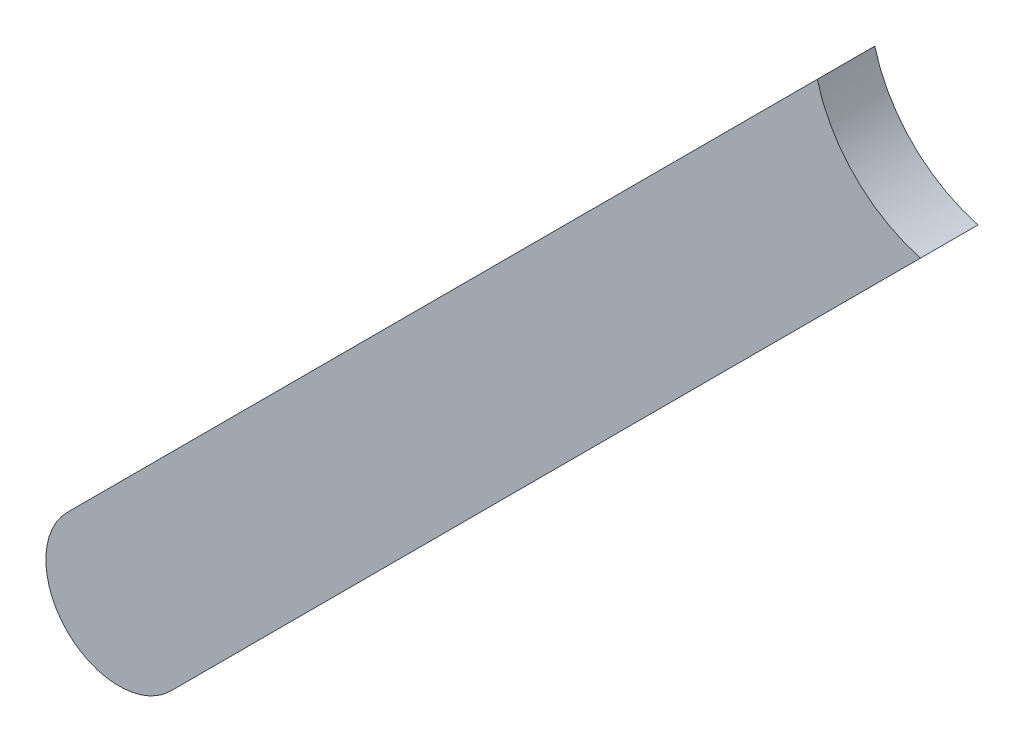
ISO-10303-21;
HEADER;
FILE_DESCRIPTION(('STEP AP214'),'2;1');
FILE_NAME('part.step','',(''),(''),'','','');
FILE_SCHEMA(('AUTOMOTIVE_DESIGN { 1 0 10303 214 1 1 1 1 }'));
ENDSEC;
DATA;
#1=APPLICATION_CONTEXT('core data for automotive mechanical design processes');
#2=APPLICATION_PROTOCOL_DEFINITION('international standard','automotive_design',2000,#1);
#3=PRODUCT_CONTEXT('',#1,'mechanical');
#4=PRODUCT('Part','Part','',(#3));
#5=PRODUCT_RELATED_PRODUCT_CATEGORY('part','',(#4));
#6=PRODUCT_DEFINITION_FORMATION('','',#4);
#7=PRODUCT_DEFINITION_CONTEXT('part definition',#1,'design');
#8=PRODUCT_DEFINITION('design','',#6,#7);
#9=PRODUCT_DEFINITION_SHAPE('','',#8);
#10=(LENGTH_UNIT() NAMED_UNIT(*) SI_UNIT(.MILLI.,.METRE.));
#11=(NAMED_UNIT(*) PLANE_ANGLE_UNIT() SI_UNIT($,.RADIAN.));
#12=(NAMED_UNIT(*) SI_UNIT($,.STERADIAN.) SOLID_ANGLE_UNIT());
#13=UNCERTAINTY_MEASURE_WITH_UNIT(LENGTH_MEASURE(1.E-05),#10,'distance_accuracy_value','');
#14=(GEOMETRIC_REPRESENTATION_CONTEXT(3) GLOBAL_UNCERTAINTY_ASSIGNED_CONTEXT((#13)) GLOBAL_UNIT_ASSIGNED_CONTEXT((#10,
#11,#12)) REPRESENTATION_CONTEXT('',''));
#15=CARTESIAN_POINT('',(0.,0.,0.));
#16=DIRECTION('',(0.,0.,1.));
#17=DIRECTION('',(1.,0.,0.));
#18=AXIS2_PLACEMENT_3D('',#15,#16,#17);
#19=CARTESIAN_POINT('',(87.42860594,96.21339406,0.));
#20=DIRECTION('',(-0.707106781186548,0.707106781186548,0.));
#21=DIRECTION('',(0.707106781186548,0.707106781186548,0.));
#22=AXIS2_PLACEMENT_3D('',#19,#20,#21);
#23=PLANE('',#22);
#24=DIRECTION('',(0.707106781186548,0.707106781186548,0.));
#25=VECTOR('',#24,1.);
#26=CARTESIAN_POINT('',(87.42860594,96.21339406,0.1999996));
#27=LINE('',#26,#25);
#28=CARTESIAN_POINT('',(87.42860594,96.21339406,0.1999996));
#29=VERTEX_POINT('',#28);
#30=CARTESIAN_POINT('',(90.0385212146972,98.8233093346972,0.1999996));
#31=VERTEX_POINT('',#30);
#32=EDGE_CURVE('E11',#29,#31,#27,.T.);
#33=ORIENTED_EDGE('',*,*,#32,.F.);
#34=DIRECTION('',(0.,0.,1.));
#35=VECTOR('',#34,1.);
#36=CARTESIAN_POINT('',(87.42860594,96.21339406,0.));
#37=LINE('',#36,#35);
#38=CARTESIAN_POINT('',(87.42860594,96.21339406,0.));
#39=VERTEX_POINT('',#38);
#40=EDGE_CURVE('E24',#39,#29,#37,.T.);
#41=ORIENTED_EDGE('',*,*,#40,.F.);
#42=DIRECTION('',(0.707106781186548,0.707106781186548,0.));
#43=VECTOR('',#42,1.);
#44=CARTESIAN_POINT('',(87.42860594,96.21339406,0.));
#45=LINE('',#44,#43);
#46=CARTESIAN_POINT('',(90.0385212146972,98.8233093346972,0.));
#47=VERTEX_POINT('',#46);
#48=EDGE_CURVE('E75',#39,#47,#45,.T.);
#49=ORIENTED_EDGE('',*,*,#48,.T.);
#50=DIRECTION('',(0.,0.,1.));
#51=VECTOR('',#50,1.);
#52=CARTESIAN_POINT('',(90.0385212146972,98.8233093346972,0.));
#53=LINE('',#52,#51);
#54=EDGE_CURVE('E37',#47,#31,#53,.T.);
#55=ORIENTED_EDGE('',*,*,#54,.T.);
#56=EDGE_LOOP('',(#33,#41,#49,#55));
#57=FACE_BOUND('',#56,.T.);
#58=ADVANCED_FACE('F17',(#57),#23,.F.);
#59=CARTESIAN_POINT('',(90.17,99.314,0.));
#60=DIRECTION('',(0.,0.,-1.));
#61=DIRECTION('',(1.,0.,0.));
#62=AXIS2_PLACEMENT_3D('',#59,#60,#61);
#63=CYLINDRICAL_SURFACE('',#62,0.508);
#64=DIRECTION('',(0.,0.,1.));
#65=VECTOR('',#64,1.);
#66=CARTESIAN_POINT('',(89.6793093346972,99.1825212146972,0.));
#67=LINE('',#66,#65);
#68=CARTESIAN_POINT('',(89.6793093346972,99.1825212146972,0.));
#69=VERTEX_POINT('',#68);
#70=CARTESIAN_POINT('',(89.6793093346972,99.1825212146972,0.1999996));
#71=VERTEX_POINT('',#70);
#72=EDGE_CURVE('E67',#69,#71,#67,.T.);
#73=ORIENTED_EDGE('',*,*,#72,.T.);
#74=CARTESIAN_POINT('',(90.17,99.314,0.1999996));
#75=DIRECTION('',(0.,0.,1.));
#76=DIRECTION('',(1.,0.,0.));
#77=AXIS2_PLACEMENT_3D('',#74,#75,#76);
#78=CIRCLE('',#77,0.508);
#79=EDGE_CURVE('E82',#71,#31,#78,.T.);
#80=ORIENTED_EDGE('',*,*,#79,.T.);
#81=ORIENTED_EDGE('',*,*,#54,.F.);
#82=CARTESIAN_POINT('',(90.17,99.314,0.));
#83=DIRECTION('',(0.,0.,1.));
#84=DIRECTION('',(1.,0.,0.));
#85=AXIS2_PLACEMENT_3D('',#82,#83,#84);
#86=CIRCLE('',#85,0.508);
#87=EDGE_CURVE('E80',#69,#47,#86,.T.);
#88=ORIENTED_EDGE('',*,*,#87,.F.);
#89=EDGE_LOOP('',(#73,#80,#81,#88));
#90=FACE_BOUND('',#89,.T.);
#91=ADVANCED_FACE('F88',(#90),#63,.F.);
#92=CARTESIAN_POINT('',(89.6793093346972,99.1825212146972,0.));
#93=DIRECTION('',(0.707106781186548,-0.707106781186548,0.));
#94=DIRECTION('',(-0.707106781186548,-0.707106781186548,0.));
#95=AXIS2_PLACEMENT_3D('',#92,#93,#94);
#96=PLANE('',#95);
#97=DIRECTION('',(-0.707106781186548,-0.707106781186548,0.));
#98=VECTOR('',#97,1.);
#99=CARTESIAN_POINT('',(89.99039406,99.49360594,0.1999996));
#100=LINE('',#99,#98);
#101=CARTESIAN_POINT('',(87.06939406,96.57260594,0.1999996));
#102=VERTEX_POINT('',#101);
#103=EDGE_CURVE('E71',#71,#102,#100,.T.);
#104=ORIENTED_EDGE('',*,*,#103,.F.);
#105=ORIENTED_EDGE('',*,*,#72,.F.);
#106=DIRECTION('',(-0.707106781186548,-0.707106781186548,0.));
#107=VECTOR('',#106,1.);
#108=CARTESIAN_POINT('',(89.99039406,99.49360594,0.));
#109=LINE('',#108,#107);
#110=CARTESIAN_POINT('',(87.06939406,96.57260594,0.));
#111=VERTEX_POINT('',#110);
#112=EDGE_CURVE('E63',#69,#111,#109,.T.);
#113=ORIENTED_EDGE('',*,*,#112,.T.);
#114=DIRECTION('',(0.,0.,1.));
#115=VECTOR('',#114,1.);
#116=CARTESIAN_POINT('',(87.06939406,96.57260594,0.));
#117=LINE('',#116,#115);
#118=EDGE_CURVE('E53',#111,#102,#117,.T.);
#119=ORIENTED_EDGE('',*,*,#118,.T.);
#120=EDGE_LOOP('',(#104,#105,#113,#119));
#121=FACE_BOUND('',#120,.T.);
#122=ADVANCED_FACE('F66',(#121),#96,.F.);
#123=CARTESIAN_POINT('',(87.249,96.393,0.));
#124=DIRECTION('',(0.,0.,-1.));
#125=DIRECTION('',(-0.707106781186576,0.70710678118652,0.));
#126=AXIS2_PLACEMENT_3D('',#123,#124,#125);
#127=CYLINDRICAL_SURFACE('',#126,0.254001156230768);
#128=CARTESIAN_POINT('',(87.249,96.393,0.1999996));
#129=DIRECTION('',(0.,0.,1.));
#130=DIRECTION('',(-0.707106781186576,0.70710678118652,0.));
#131=AXIS2_PLACEMENT_3D('',#128,#129,#130);
#132=CIRCLE('',#131,0.254001156230768);
#133=EDGE_CURVE('E59',#102,#29,#132,.T.);
#134=ORIENTED_EDGE('',*,*,#133,.F.);
#135=ORIENTED_EDGE('',*,*,#118,.F.);
#136=CARTESIAN_POINT('',(87.249,96.393,0.));
#137=DIRECTION('',(0.,0.,1.));
#138=DIRECTION('',(-0.707106781186576,0.70710678118652,0.));
#139=AXIS2_PLACEMENT_3D('',#136,#137,#138);
#140=CIRCLE('',#139,0.254001156230768);
#141=EDGE_CURVE('E57',#111,#39,#140,.T.);
#142=ORIENTED_EDGE('',*,*,#141,.T.);
#143=ORIENTED_EDGE('',*,*,#40,.T.);
#144=EDGE_LOOP('',(#134,#135,#142,#143));
#145=FACE_BOUND('',#144,.T.);
#146=ADVANCED_FACE('F55',(#145),#127,.T.);
#147=CARTESIAN_POINT('',(87.42860594,96.21339406,0.));
#148=DIRECTION('',(0.,0.,-1.));
#149=DIRECTION('',(-1.,0.,0.));
#150=AXIS2_PLACEMENT_3D('',#147,#148,#149);
#151=PLANE('',#150);
#152=ORIENTED_EDGE('',*,*,#48,.F.);
#153=ORIENTED_EDGE('',*,*,#141,.F.);
#154=ORIENTED_EDGE('',*,*,#112,.F.);
#155=ORIENTED_EDGE('',*,*,#87,.T.);
#156=EDGE_LOOP('',(#152,#153,#154,#155));
#157=FACE_BOUND('',#156,.T.);
#158=ADVANCED_FACE('F74',(#157),#151,.T.);
#159=CARTESIAN_POINT('',(87.42860594,96.21339406,0.1999996));
#160=DIRECTION('',(0.,0.,-1.));
#161=DIRECTION('',(-1.,0.,0.));
#162=AXIS2_PLACEMENT_3D('',#159,#160,#161);
#163=PLANE('',#162);
#164=ORIENTED_EDGE('',*,*,#133,.T.);
#165=ORIENTED_EDGE('',*,*,#32,.T.);
#166=ORIENTED_EDGE('',*,*,#79,.F.);
#167=ORIENTED_EDGE('',*,*,#103,.T.);
#168=EDGE_LOOP('',(#164,#165,#166,#167));
#169=FACE_BOUND('',#168,.T.);
#170=ADVANCED_FACE('F91',(#169),#163,.F.);
#171=CLOSED_SHELL('',(#58,#91,#122,#146,#158,#170));
#172=MANIFOLD_SOLID_BREP('B1',#171);
#173=ADVANCED_BREP_SHAPE_REPRESENTATION('',(#18,#172),#14);
#174=SHAPE_DEFINITION_REPRESENTATION(#9,#173);
ENDSEC;
END-ISO-10303-21;
